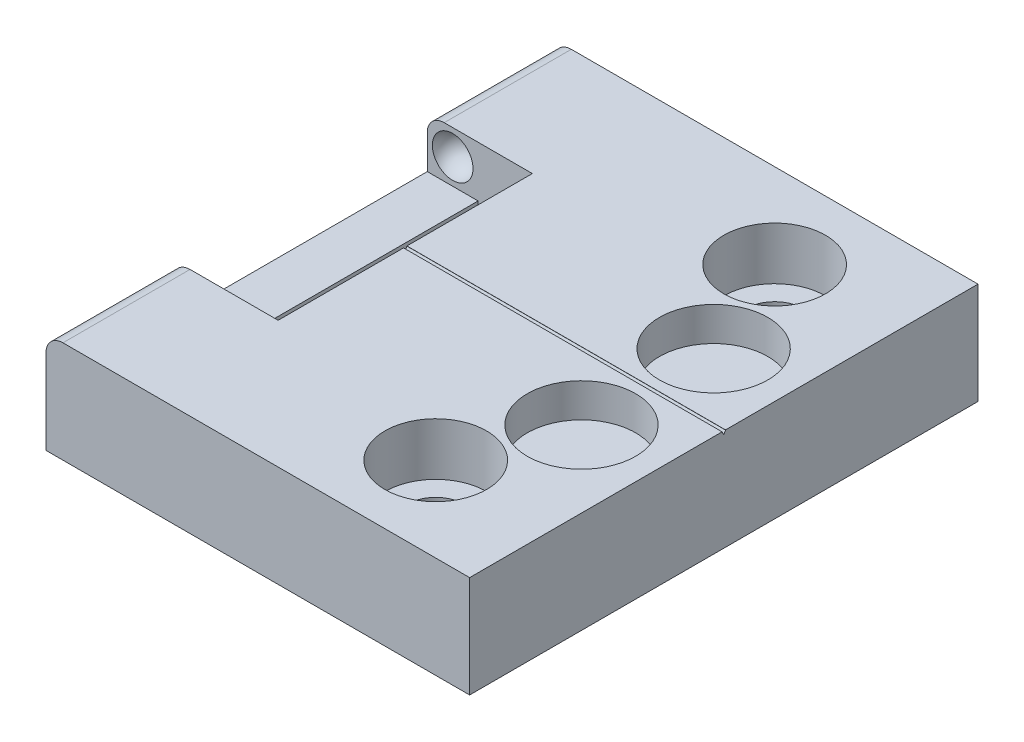
ISO-10303-21;
HEADER;
FILE_DESCRIPTION(('STEP AP214'),'2;1');
FILE_NAME('part.step','',(''),(''),'','','');
FILE_SCHEMA(('AUTOMOTIVE_DESIGN { 1 0 10303 214 1 1 1 1 }'));
ENDSEC;
DATA;
#1=APPLICATION_CONTEXT('core data for automotive mechanical design processes');
#2=APPLICATION_PROTOCOL_DEFINITION('international standard','automotive_design',2000,#1);
#3=PRODUCT_CONTEXT('',#1,'mechanical');
#4=PRODUCT('Part','Part','',(#3));
#5=PRODUCT_RELATED_PRODUCT_CATEGORY('part','',(#4));
#6=PRODUCT_DEFINITION_FORMATION('','',#4);
#7=PRODUCT_DEFINITION_CONTEXT('part definition',#1,'design');
#8=PRODUCT_DEFINITION('design','',#6,#7);
#9=PRODUCT_DEFINITION_SHAPE('','',#8);
#10=(LENGTH_UNIT() NAMED_UNIT(*) SI_UNIT(.MILLI.,.METRE.));
#11=(NAMED_UNIT(*) PLANE_ANGLE_UNIT() SI_UNIT($,.RADIAN.));
#12=(NAMED_UNIT(*) SI_UNIT($,.STERADIAN.) SOLID_ANGLE_UNIT());
#13=UNCERTAINTY_MEASURE_WITH_UNIT(LENGTH_MEASURE(1.E-05),#10,'distance_accuracy_value','');
#14=(GEOMETRIC_REPRESENTATION_CONTEXT(3) GLOBAL_UNCERTAINTY_ASSIGNED_CONTEXT((#13)) GLOBAL_UNIT_ASSIGNED_CONTEXT((#10,
#11,#12)) REPRESENTATION_CONTEXT('',''));
#15=CARTESIAN_POINT('',(0.,0.,0.));
#16=DIRECTION('',(0.,0.,1.));
#17=DIRECTION('',(1.,0.,0.));
#18=AXIS2_PLACEMENT_3D('',#15,#16,#17);
#19=CARTESIAN_POINT('',(0.,6.,0.));
#20=DIRECTION('',(0.,1.,0.));
#21=DIRECTION('',(0.,0.,1.));
#22=AXIS2_PLACEMENT_3D('',#19,#20,#21);
#23=PLANE('',#22);
#24=DIRECTION('',(-1.,0.,0.));
#25=VECTOR('',#24,1.);
#26=CARTESIAN_POINT('',(-12.5,6.,-7.5));
#27=LINE('',#26,#25);
#28=CARTESIAN_POINT('',(-6.29999999999999,6.,-7.5));
#29=VERTEX_POINT('',#28);
#30=CARTESIAN_POINT('',(-11.5,6.,-7.5));
#31=VERTEX_POINT('',#30);
#32=EDGE_CURVE('E224',#29,#31,#27,.T.);
#33=ORIENTED_EDGE('',*,*,#32,.F.);
#34=DIRECTION('',(0.,0.,-1.));
#35=VECTOR('',#34,1.);
#36=CARTESIAN_POINT('',(-6.29999999999999,6.,-7.5));
#37=LINE('',#36,#35);
#38=CARTESIAN_POINT('',(-6.29999999999999,6.,-0.1));
#39=VERTEX_POINT('',#38);
#40=EDGE_CURVE('E191',#39,#29,#37,.T.);
#41=ORIENTED_EDGE('',*,*,#40,.F.);
#42=DIRECTION('',(1.,0.,0.));
#43=VECTOR('',#42,1.);
#44=CARTESIAN_POINT('',(-7.5,6.,-0.1));
#45=LINE('',#44,#43);
#46=CARTESIAN_POINT('',(12.5,6.,-0.0999999999999994));
#47=VERTEX_POINT('',#46);
#48=EDGE_CURVE('E278',#39,#47,#45,.T.);
#49=ORIENTED_EDGE('',*,*,#48,.T.);
#50=DIRECTION('',(0.,0.,-1.));
#51=VECTOR('',#50,1.);
#52=CARTESIAN_POINT('',(12.5,6.,15.));
#53=LINE('',#52,#51);
#54=CARTESIAN_POINT('',(12.5,6.,-15.));
#55=VERTEX_POINT('',#54);
#56=EDGE_CURVE('E329',#47,#55,#53,.T.);
#57=ORIENTED_EDGE('',*,*,#56,.T.);
#58=DIRECTION('',(-1.,0.,0.));
#59=VECTOR('',#58,1.);
#60=CARTESIAN_POINT('',(12.5,6.,-15.));
#61=LINE('',#60,#59);
#62=CARTESIAN_POINT('',(-11.5,6.,-15.));
#63=VERTEX_POINT('',#62);
#64=EDGE_CURVE('E335',#55,#63,#61,.T.);
#65=ORIENTED_EDGE('',*,*,#64,.T.);
#66=DIRECTION('',(0.,0.,1.));
#67=VECTOR('',#66,1.);
#68=CARTESIAN_POINT('',(-11.5,6.,-7.5));
#69=LINE('',#68,#67);
#70=EDGE_CURVE('E365',#63,#31,#69,.T.);
#71=ORIENTED_EDGE('',*,*,#70,.T.);
#72=EDGE_LOOP('',(#33,#41,#49,#57,#65,#71));
#73=FACE_BOUND('',#72,.T.);
#74=CARTESIAN_POINT('',(5.5,6.,-9.99999999999999));
#75=DIRECTION('',(0.,1.,0.));
#76=DIRECTION('',(0.,0.,1.));
#77=AXIS2_PLACEMENT_3D('',#74,#75,#76);
#78=CIRCLE('',#77,3.);
#79=CARTESIAN_POINT('',(5.5,6.,-6.99999999999999));
#80=VERTEX_POINT('',#79);
#81=EDGE_CURVE('E290',#80,#80,#78,.T.);
#82=ORIENTED_EDGE('',*,*,#81,.F.);
#83=EDGE_LOOP('',(#82));
#84=FACE_BOUND('',#83,.T.);
#85=CARTESIAN_POINT('',(8.,6.,-3.9));
#86=DIRECTION('',(0.,1.,0.));
#87=DIRECTION('',(0.,0.,1.));
#88=AXIS2_PLACEMENT_3D('',#85,#86,#87);
#89=CIRCLE('',#88,3.2);
#90=CARTESIAN_POINT('',(8.,6.,-0.699999999999998));
#91=VERTEX_POINT('',#90);
#92=EDGE_CURVE('E267',#91,#91,#89,.T.);
#93=ORIENTED_EDGE('',*,*,#92,.F.);
#94=EDGE_LOOP('',(#93));
#95=FACE_BOUND('',#94,.T.);
#96=ADVANCED_FACE('F39',(#73,#84,#95),#23,.T.);
#97=CARTESIAN_POINT('',(-12.5,6.,15.));
#98=DIRECTION('',(1.,0.,0.));
#99=DIRECTION('',(0.,0.,-1.));
#100=AXIS2_PLACEMENT_3D('',#97,#98,#99);
#101=PLANE('',#100);
#102=DIRECTION('',(0.,-1.,0.));
#103=VECTOR('',#102,1.);
#104=CARTESIAN_POINT('',(-12.5,6.,15.));
#105=LINE('',#104,#103);
#106=CARTESIAN_POINT('',(-12.5,5.,15.));
#107=VERTEX_POINT('',#106);
#108=CARTESIAN_POINT('',(-12.5,0.,15.));
#109=VERTEX_POINT('',#108);
#110=EDGE_CURVE('E362',#107,#109,#105,.T.);
#111=ORIENTED_EDGE('',*,*,#110,.F.);
#112=DIRECTION('',(0.,0.,1.));
#113=VECTOR('',#112,1.);
#114=CARTESIAN_POINT('',(-12.5,5.,7.5));
#115=LINE('',#114,#113);
#116=CARTESIAN_POINT('',(-12.5,5.,7.5));
#117=VERTEX_POINT('',#116);
#118=EDGE_CURVE('E55',#107,#117,#115,.F.);
#119=ORIENTED_EDGE('',*,*,#118,.T.);
#120=DIRECTION('',(0.,1.,0.));
#121=VECTOR('',#120,1.);
#122=CARTESIAN_POINT('',(-12.5,3.,7.5));
#123=LINE('',#122,#121);
#124=CARTESIAN_POINT('',(-12.5,3.,7.5));
#125=VERTEX_POINT('',#124);
#126=EDGE_CURVE('E233',#125,#117,#123,.T.);
#127=ORIENTED_EDGE('',*,*,#126,.F.);
#128=DIRECTION('',(0.,0.,1.));
#129=VECTOR('',#128,1.);
#130=CARTESIAN_POINT('',(-12.5,3.,-7.5));
#131=LINE('',#130,#129);
#132=CARTESIAN_POINT('',(-12.5,3.,-7.5));
#133=VERTEX_POINT('',#132);
#134=EDGE_CURVE('E219',#133,#125,#131,.T.);
#135=ORIENTED_EDGE('',*,*,#134,.F.);
#136=DIRECTION('',(0.,1.,0.));
#137=VECTOR('',#136,1.);
#138=CARTESIAN_POINT('',(-12.5,3.,-7.5));
#139=LINE('',#138,#137);
#140=CARTESIAN_POINT('',(-12.5,5.,-7.5));
#141=VERTEX_POINT('',#140);
#142=EDGE_CURVE('E241',#133,#141,#139,.T.);
#143=ORIENTED_EDGE('',*,*,#142,.T.);
#144=DIRECTION('',(0.,0.,1.));
#145=VECTOR('',#144,1.);
#146=CARTESIAN_POINT('',(-12.5,5.,-15.));
#147=LINE('',#146,#145);
#148=CARTESIAN_POINT('',(-12.5,5.,-15.));
#149=VERTEX_POINT('',#148);
#150=EDGE_CURVE('E62',#141,#149,#147,.F.);
#151=ORIENTED_EDGE('',*,*,#150,.T.);
#152=DIRECTION('',(0.,-1.,0.));
#153=VECTOR('',#152,1.);
#154=CARTESIAN_POINT('',(-12.5,6.,-15.));
#155=LINE('',#154,#153);
#156=CARTESIAN_POINT('',(-12.5,0.,-15.));
#157=VERTEX_POINT('',#156);
#158=EDGE_CURVE('E339',#149,#157,#155,.T.);
#159=ORIENTED_EDGE('',*,*,#158,.T.);
#160=DIRECTION('',(0.,0.,1.));
#161=VECTOR('',#160,1.);
#162=CARTESIAN_POINT('',(-12.5,0.,15.));
#163=LINE('',#162,#161);
#164=EDGE_CURVE('E325',#157,#109,#163,.T.);
#165=ORIENTED_EDGE('',*,*,#164,.T.);
#166=EDGE_LOOP('',(#111,#119,#127,#135,#143,#151,#159,#165));
#167=FACE_BOUND('',#166,.T.);
#168=ADVANCED_FACE('F406',(#167),#101,.F.);
#169=CARTESIAN_POINT('',(12.5,6.,15.));
#170=DIRECTION('',(0.,0.,-1.));
#171=DIRECTION('',(-1.,0.,0.));
#172=AXIS2_PLACEMENT_3D('',#169,#170,#171);
#173=PLANE('',#172);
#174=DIRECTION('',(1.,0.,0.));
#175=VECTOR('',#174,1.);
#176=CARTESIAN_POINT('',(12.5,6.,15.));
#177=LINE('',#176,#175);
#178=CARTESIAN_POINT('',(-11.5,6.,15.));
#179=VERTEX_POINT('',#178);
#180=CARTESIAN_POINT('',(12.5,6.,15.));
#181=VERTEX_POINT('',#180);
#182=EDGE_CURVE('E326',#179,#181,#177,.T.);
#183=ORIENTED_EDGE('',*,*,#182,.F.);
#184=CARTESIAN_POINT('',(-11.5,5.,15.));
#185=DIRECTION('',(0.,0.,-1.));
#186=DIRECTION('',(-1.,0.,0.));
#187=AXIS2_PLACEMENT_3D('',#184,#185,#186);
#188=CIRCLE('',#187,1.);
#189=EDGE_CURVE('E379',#179,#107,#188,.F.);
#190=ORIENTED_EDGE('',*,*,#189,.T.);
#191=ORIENTED_EDGE('',*,*,#110,.T.);
#192=DIRECTION('',(1.,0.,0.));
#193=VECTOR('',#192,1.);
#194=CARTESIAN_POINT('',(12.5,0.,15.));
#195=LINE('',#194,#193);
#196=CARTESIAN_POINT('',(12.5,0.,15.));
#197=VERTEX_POINT('',#196);
#198=EDGE_CURVE('E343',#109,#197,#195,.T.);
#199=ORIENTED_EDGE('',*,*,#198,.T.);
#200=DIRECTION('',(0.,-1.,0.));
#201=VECTOR('',#200,1.);
#202=CARTESIAN_POINT('',(12.5,6.,15.));
#203=LINE('',#202,#201);
#204=EDGE_CURVE('E358',#181,#197,#203,.T.);
#205=ORIENTED_EDGE('',*,*,#204,.F.);
#206=EDGE_LOOP('',(#183,#190,#191,#199,#205));
#207=FACE_BOUND('',#206,.T.);
#208=ADVANCED_FACE('F470',(#207),#173,.F.);
#209=CARTESIAN_POINT('',(12.5,6.,15.));
#210=DIRECTION('',(-1.,0.,0.));
#211=DIRECTION('',(0.,0.,1.));
#212=AXIS2_PLACEMENT_3D('',#209,#210,#211);
#213=PLANE('',#212);
#214=DIRECTION('',(0.,1.,0.));
#215=VECTOR('',#214,1.);
#216=CARTESIAN_POINT('',(12.5,5.99,-0.1));
#217=LINE('',#216,#215);
#218=CARTESIAN_POINT('',(12.5,5.99,-0.1));
#219=VERTEX_POINT('',#218);
#220=EDGE_CURVE('E286',#219,#47,#217,.T.);
#221=ORIENTED_EDGE('',*,*,#220,.F.);
#222=DIRECTION('',(0.,0.884918222381981,-0.465746432832625));
#223=VECTOR('',#222,1.);
#224=CARTESIAN_POINT('',(12.5,5.8,0.));
#225=LINE('',#224,#223);
#226=CARTESIAN_POINT('',(12.5,5.8,0.));
#227=VERTEX_POINT('',#226);
#228=EDGE_CURVE('E250',#227,#219,#225,.T.);
#229=ORIENTED_EDGE('',*,*,#228,.F.);
#230=DIRECTION('',(0.,-0.884918222381981,-0.465746432832626));
#231=VECTOR('',#230,1.);
#232=CARTESIAN_POINT('',(12.5,5.99,0.1));
#233=LINE('',#232,#231);
#234=CARTESIAN_POINT('',(12.5,5.99,0.1));
#235=VERTEX_POINT('',#234);
#236=EDGE_CURVE('E244',#235,#227,#233,.T.);
#237=ORIENTED_EDGE('',*,*,#236,.F.);
#238=DIRECTION('',(0.,1.,0.));
#239=VECTOR('',#238,1.);
#240=CARTESIAN_POINT('',(12.5,5.99,0.1));
#241=LINE('',#240,#239);
#242=CARTESIAN_POINT('',(12.5,6.,0.1));
#243=VERTEX_POINT('',#242);
#244=EDGE_CURVE('E281',#235,#243,#241,.T.);
#245=ORIENTED_EDGE('',*,*,#244,.T.);
#246=EDGE_CURVE('E331',#181,#243,#53,.T.);
#247=ORIENTED_EDGE('',*,*,#246,.F.);
#248=ORIENTED_EDGE('',*,*,#204,.T.);
#249=DIRECTION('',(0.,0.,-1.));
#250=VECTOR('',#249,1.);
#251=CARTESIAN_POINT('',(12.5,0.,15.));
#252=LINE('',#251,#250);
#253=CARTESIAN_POINT('',(12.5,0.,-15.));
#254=VERTEX_POINT('',#253);
#255=EDGE_CURVE('E346',#197,#254,#252,.T.);
#256=ORIENTED_EDGE('',*,*,#255,.T.);
#257=DIRECTION('',(0.,-1.,0.));
#258=VECTOR('',#257,1.);
#259=CARTESIAN_POINT('',(12.5,6.,-15.));
#260=LINE('',#259,#258);
#261=EDGE_CURVE('E354',#55,#254,#260,.T.);
#262=ORIENTED_EDGE('',*,*,#261,.F.);
#263=ORIENTED_EDGE('',*,*,#56,.F.);
#264=EDGE_LOOP('',(#221,#229,#237,#245,#247,#248,#256,#262,#263));
#265=FACE_BOUND('',#264,.T.);
#266=ADVANCED_FACE('F422',(#265),#213,.F.);
#267=CARTESIAN_POINT('',(12.5,6.,-15.));
#268=DIRECTION('',(0.,0.,1.));
#269=DIRECTION('',(1.,0.,0.));
#270=AXIS2_PLACEMENT_3D('',#267,#268,#269);
#271=PLANE('',#270);
#272=ORIENTED_EDGE('',*,*,#158,.F.);
#273=CARTESIAN_POINT('',(-11.5,5.,-15.));
#274=DIRECTION('',(0.,0.,1.));
#275=DIRECTION('',(1.,0.,0.));
#276=AXIS2_PLACEMENT_3D('',#273,#274,#275);
#277=CIRCLE('',#276,1.);
#278=EDGE_CURVE('E48',#149,#63,#277,.F.);
#279=ORIENTED_EDGE('',*,*,#278,.T.);
#280=ORIENTED_EDGE('',*,*,#64,.F.);
#281=ORIENTED_EDGE('',*,*,#261,.T.);
#282=DIRECTION('',(-1.,0.,0.));
#283=VECTOR('',#282,1.);
#284=CARTESIAN_POINT('',(12.5,0.,-15.));
#285=LINE('',#284,#283);
#286=EDGE_CURVE('E330',#254,#157,#285,.T.);
#287=ORIENTED_EDGE('',*,*,#286,.T.);
#288=EDGE_LOOP('',(#272,#279,#280,#281,#287));
#289=FACE_BOUND('',#288,.T.);
#290=ADVANCED_FACE('F395',(#289),#271,.F.);
#291=CARTESIAN_POINT('',(-6.29999999999999,6.,7.5));
#292=VERTEX_POINT('',#291);
#293=CARTESIAN_POINT('',(-6.29999999999999,6.,0.1));
#294=VERTEX_POINT('',#293);
#295=EDGE_CURVE('E188',#292,#294,#37,.T.);
#296=ORIENTED_EDGE('',*,*,#295,.F.);
#297=DIRECTION('',(1.,0.,0.));
#298=VECTOR('',#297,1.);
#299=CARTESIAN_POINT('',(-12.5,6.,7.5));
#300=LINE('',#299,#298);
#301=CARTESIAN_POINT('',(-11.5,6.,7.5));
#302=VERTEX_POINT('',#301);
#303=EDGE_CURVE('E234',#302,#292,#300,.T.);
#304=ORIENTED_EDGE('',*,*,#303,.F.);
#305=DIRECTION('',(0.,0.,1.));
#306=VECTOR('',#305,1.);
#307=CARTESIAN_POINT('',(-11.5,6.,15.));
#308=LINE('',#307,#306);
#309=EDGE_CURVE('E375',#302,#179,#308,.T.);
#310=ORIENTED_EDGE('',*,*,#309,.T.);
#311=ORIENTED_EDGE('',*,*,#182,.T.);
#312=ORIENTED_EDGE('',*,*,#246,.T.);
#313=DIRECTION('',(1.,0.,0.));
#314=VECTOR('',#313,1.);
#315=CARTESIAN_POINT('',(-7.5,6.,0.1));
#316=LINE('',#315,#314);
#317=EDGE_CURVE('E262',#294,#243,#316,.T.);
#318=ORIENTED_EDGE('',*,*,#317,.F.);
#319=EDGE_LOOP('',(#296,#304,#310,#311,#312,#318));
#320=FACE_BOUND('',#319,.T.);
#321=CARTESIAN_POINT('',(8.,6.,3.9));
#322=DIRECTION('',(0.,1.,0.));
#323=DIRECTION('',(0.,0.,1.));
#324=AXIS2_PLACEMENT_3D('',#321,#322,#323);
#325=CIRCLE('',#324,3.2);
#326=CARTESIAN_POINT('',(8.,6.,7.1));
#327=VERTEX_POINT('',#326);
#328=EDGE_CURVE('E263',#327,#327,#325,.T.);
#329=ORIENTED_EDGE('',*,*,#328,.F.);
#330=EDGE_LOOP('',(#329));
#331=FACE_BOUND('',#330,.T.);
#332=CARTESIAN_POINT('',(5.50000000000001,6.,10.));
#333=DIRECTION('',(0.,1.,0.));
#334=DIRECTION('',(0.,0.,1.));
#335=AXIS2_PLACEMENT_3D('',#332,#333,#334);
#336=CIRCLE('',#335,3.);
#337=CARTESIAN_POINT('',(5.50000000000001,6.,13.));
#338=VERTEX_POINT('',#337);
#339=EDGE_CURVE('E309',#338,#338,#336,.T.);
#340=ORIENTED_EDGE('',*,*,#339,.F.);
#341=EDGE_LOOP('',(#340));
#342=FACE_BOUND('',#341,.T.);
#343=ADVANCED_FACE('F438',(#320,#331,#342),#23,.T.);
#344=CARTESIAN_POINT('',(0.,0.,0.));
#345=DIRECTION('',(0.,1.,0.));
#346=DIRECTION('',(0.,0.,1.));
#347=AXIS2_PLACEMENT_3D('',#344,#345,#346);
#348=PLANE('',#347);
#349=CARTESIAN_POINT('',(5.5,0.,-9.99999999999999));
#350=DIRECTION('',(0.,1.,0.));
#351=DIRECTION('',(0.,0.,1.));
#352=AXIS2_PLACEMENT_3D('',#349,#350,#351);
#353=CIRCLE('',#352,1.7);
#354=CARTESIAN_POINT('',(5.5,0.,-8.3));
#355=VERTEX_POINT('',#354);
#356=EDGE_CURVE('E305',#355,#355,#353,.T.);
#357=ORIENTED_EDGE('',*,*,#356,.T.);
#358=EDGE_LOOP('',(#357));
#359=FACE_BOUND('',#358,.T.);
#360=CARTESIAN_POINT('',(5.50000000000001,0.,10.));
#361=DIRECTION('',(0.,1.,0.));
#362=DIRECTION('',(0.,0.,1.));
#363=AXIS2_PLACEMENT_3D('',#360,#361,#362);
#364=CIRCLE('',#363,1.7);
#365=CARTESIAN_POINT('',(5.50000000000001,0.,11.7));
#366=VERTEX_POINT('',#365);
#367=EDGE_CURVE('E321',#366,#366,#364,.T.);
#368=ORIENTED_EDGE('',*,*,#367,.T.);
#369=EDGE_LOOP('',(#368));
#370=FACE_BOUND('',#369,.T.);
#371=ORIENTED_EDGE('',*,*,#164,.F.);
#372=ORIENTED_EDGE('',*,*,#286,.F.);
#373=ORIENTED_EDGE('',*,*,#255,.F.);
#374=ORIENTED_EDGE('',*,*,#198,.F.);
#375=EDGE_LOOP('',(#371,#372,#373,#374));
#376=FACE_BOUND('',#375,.T.);
#377=ADVANCED_FACE('F428',(#359,#370,#376),#348,.F.);
#378=CARTESIAN_POINT('',(5.50000000000001,6.,10.));
#379=DIRECTION('',(0.,1.,0.));
#380=DIRECTION('',(0.,0.,1.));
#381=AXIS2_PLACEMENT_3D('',#378,#379,#380);
#382=CYLINDRICAL_SURFACE('',#381,1.7);
#383=ORIENTED_EDGE('',*,*,#367,.F.);
#384=EDGE_LOOP('',(#383));
#385=FACE_BOUND('',#384,.T.);
#386=CARTESIAN_POINT('',(5.50000000000001,2.9,10.));
#387=DIRECTION('',(0.,1.,0.));
#388=DIRECTION('',(0.,0.,1.));
#389=AXIS2_PLACEMENT_3D('',#386,#387,#388);
#390=CIRCLE('',#389,1.7);
#391=CARTESIAN_POINT('',(5.50000000000001,2.9,11.7));
#392=VERTEX_POINT('',#391);
#393=EDGE_CURVE('E317',#392,#392,#390,.T.);
#394=ORIENTED_EDGE('',*,*,#393,.T.);
#395=EDGE_LOOP('',(#394));
#396=FACE_BOUND('',#395,.T.);
#397=ADVANCED_FACE('F479',(#385,#396),#382,.F.);
#398=CARTESIAN_POINT('',(7.2,2.9,10.));
#399=DIRECTION('',(0.,-1.,0.));
#400=DIRECTION('',(0.,0.,-1.));
#401=AXIS2_PLACEMENT_3D('',#398,#399,#400);
#402=PLANE('',#401);
#403=ORIENTED_EDGE('',*,*,#393,.F.);
#404=EDGE_LOOP('',(#403));
#405=FACE_BOUND('',#404,.T.);
#406=CARTESIAN_POINT('',(5.50000000000001,2.9,10.));
#407=DIRECTION('',(0.,1.,0.));
#408=DIRECTION('',(0.,0.,1.));
#409=AXIS2_PLACEMENT_3D('',#406,#407,#408);
#410=CIRCLE('',#409,3.);
#411=CARTESIAN_POINT('',(5.50000000000001,2.9,13.));
#412=VERTEX_POINT('',#411);
#413=EDGE_CURVE('E313',#412,#412,#410,.T.);
#414=ORIENTED_EDGE('',*,*,#413,.T.);
#415=EDGE_LOOP('',(#414));
#416=FACE_BOUND('',#415,.T.);
#417=ADVANCED_FACE('F572',(#405,#416),#402,.F.);
#418=CARTESIAN_POINT('',(5.50000000000001,6.,10.));
#419=DIRECTION('',(0.,1.,0.));
#420=DIRECTION('',(0.,0.,1.));
#421=AXIS2_PLACEMENT_3D('',#418,#419,#420);
#422=CYLINDRICAL_SURFACE('',#421,3.);
#423=ORIENTED_EDGE('',*,*,#413,.F.);
#424=EDGE_LOOP('',(#423));
#425=FACE_BOUND('',#424,.T.);
#426=ORIENTED_EDGE('',*,*,#339,.T.);
#427=EDGE_LOOP('',(#426));
#428=FACE_BOUND('',#427,.T.);
#429=ADVANCED_FACE('F581',(#425,#428),#422,.F.);
#430=CARTESIAN_POINT('',(5.5,6.,-9.99999999999999));
#431=DIRECTION('',(0.,1.,0.));
#432=DIRECTION('',(0.,0.,1.));
#433=AXIS2_PLACEMENT_3D('',#430,#431,#432);
#434=CYLINDRICAL_SURFACE('',#433,1.7);
#435=ORIENTED_EDGE('',*,*,#356,.F.);
#436=EDGE_LOOP('',(#435));
#437=FACE_BOUND('',#436,.T.);
#438=CARTESIAN_POINT('',(5.5,2.9,-9.99999999999999));
#439=DIRECTION('',(0.,1.,0.));
#440=DIRECTION('',(0.,0.,1.));
#441=AXIS2_PLACEMENT_3D('',#438,#439,#440);
#442=CIRCLE('',#441,1.7);
#443=CARTESIAN_POINT('',(5.5,2.9,-8.3));
#444=VERTEX_POINT('',#443);
#445=EDGE_CURVE('E301',#444,#444,#442,.T.);
#446=ORIENTED_EDGE('',*,*,#445,.T.);
#447=EDGE_LOOP('',(#446));
#448=FACE_BOUND('',#447,.T.);
#449=ADVANCED_FACE('F590',(#437,#448),#434,.F.);
#450=CARTESIAN_POINT('',(7.2,2.9,-9.99999999999999));
#451=DIRECTION('',(0.,-1.,0.));
#452=DIRECTION('',(0.,0.,-1.));
#453=AXIS2_PLACEMENT_3D('',#450,#451,#452);
#454=PLANE('',#453);
#455=ORIENTED_EDGE('',*,*,#445,.F.);
#456=EDGE_LOOP('',(#455));
#457=FACE_BOUND('',#456,.T.);
#458=CARTESIAN_POINT('',(5.5,2.9,-9.99999999999999));
#459=DIRECTION('',(0.,1.,0.));
#460=DIRECTION('',(0.,0.,1.));
#461=AXIS2_PLACEMENT_3D('',#458,#459,#460);
#462=CIRCLE('',#461,3.);
#463=CARTESIAN_POINT('',(5.5,2.9,-6.99999999999999));
#464=VERTEX_POINT('',#463);
#465=EDGE_CURVE('E297',#464,#464,#462,.T.);
#466=ORIENTED_EDGE('',*,*,#465,.T.);
#467=EDGE_LOOP('',(#466));
#468=FACE_BOUND('',#467,.T.);
#469=ADVANCED_FACE('F599',(#457,#468),#454,.F.);
#470=CARTESIAN_POINT('',(5.5,6.,-9.99999999999999));
#471=DIRECTION('',(0.,1.,0.));
#472=DIRECTION('',(0.,0.,1.));
#473=AXIS2_PLACEMENT_3D('',#470,#471,#472);
#474=CYLINDRICAL_SURFACE('',#473,3.);
#475=ORIENTED_EDGE('',*,*,#465,.F.);
#476=EDGE_LOOP('',(#475));
#477=FACE_BOUND('',#476,.T.);
#478=ORIENTED_EDGE('',*,*,#81,.T.);
#479=EDGE_LOOP('',(#478));
#480=FACE_BOUND('',#479,.T.);
#481=ADVANCED_FACE('F608',(#477,#480),#474,.F.);
#482=CARTESIAN_POINT('',(-7.5,5.99,0.1));
#483=DIRECTION('',(0.,0.,1.));
#484=DIRECTION('',(1.,0.,0.));
#485=AXIS2_PLACEMENT_3D('',#482,#483,#484);
#486=PLANE('',#485);
#487=DIRECTION('',(1.,0.,0.));
#488=VECTOR('',#487,1.);
#489=CARTESIAN_POINT('',(-7.5,5.99,0.1));
#490=LINE('',#489,#488);
#491=CARTESIAN_POINT('',(-6.29999999999999,5.99,0.0999999999999998));
#492=VERTEX_POINT('',#491);
#493=EDGE_CURVE('E274',#492,#235,#490,.T.);
#494=ORIENTED_EDGE('',*,*,#493,.F.);
#495=DIRECTION('',(0.,1.,0.));
#496=VECTOR('',#495,1.);
#497=CARTESIAN_POINT('',(-6.29999999999999,5.99,0.1));
#498=LINE('',#497,#496);
#499=EDGE_CURVE('E214',#492,#294,#498,.T.);
#500=ORIENTED_EDGE('',*,*,#499,.T.);
#501=ORIENTED_EDGE('',*,*,#317,.T.);
#502=ORIENTED_EDGE('',*,*,#244,.F.);
#503=EDGE_LOOP('',(#494,#500,#501,#502));
#504=FACE_BOUND('',#503,.T.);
#505=ADVANCED_FACE('F444',(#504),#486,.F.);
#506=CARTESIAN_POINT('',(-7.5,5.99,-0.1));
#507=DIRECTION('',(0.,0.,1.));
#508=DIRECTION('',(1.,0.,0.));
#509=AXIS2_PLACEMENT_3D('',#506,#507,#508);
#510=PLANE('',#509);
#511=DIRECTION('',(0.,1.,0.));
#512=VECTOR('',#511,1.);
#513=CARTESIAN_POINT('',(-6.29999999999999,5.99,-0.1));
#514=LINE('',#513,#512);
#515=CARTESIAN_POINT('',(-6.29999999999999,5.99,-0.0999999999999998));
#516=VERTEX_POINT('',#515);
#517=EDGE_CURVE('E211',#516,#39,#514,.T.);
#518=ORIENTED_EDGE('',*,*,#517,.F.);
#519=DIRECTION('',(1.,0.,0.));
#520=VECTOR('',#519,1.);
#521=CARTESIAN_POINT('',(-7.5,5.99,-0.1));
#522=LINE('',#521,#520);
#523=EDGE_CURVE('E277',#516,#219,#522,.T.);
#524=ORIENTED_EDGE('',*,*,#523,.T.);
#525=ORIENTED_EDGE('',*,*,#220,.T.);
#526=ORIENTED_EDGE('',*,*,#48,.F.);
#527=EDGE_LOOP('',(#518,#524,#525,#526));
#528=FACE_BOUND('',#527,.T.);
#529=ADVANCED_FACE('F417',(#528),#510,.T.);
#530=CARTESIAN_POINT('',(8.,4.,-3.9));
#531=DIRECTION('',(0.,1.,0.));
#532=DIRECTION('',(0.,0.,1.));
#533=AXIS2_PLACEMENT_3D('',#530,#531,#532);
#534=CYLINDRICAL_SURFACE('',#533,3.2);
#535=CARTESIAN_POINT('',(8.,4.,-3.9));
#536=DIRECTION('',(0.,1.,0.));
#537=DIRECTION('',(0.,0.,1.));
#538=AXIS2_PLACEMENT_3D('',#535,#536,#537);
#539=CIRCLE('',#538,3.2);
#540=CARTESIAN_POINT('',(8.,4.,-0.699999999999998));
#541=VERTEX_POINT('',#540);
#542=EDGE_CURVE('E257',#541,#541,#539,.T.);
#543=ORIENTED_EDGE('',*,*,#542,.F.);
#544=EDGE_LOOP('',(#543));
#545=FACE_BOUND('',#544,.T.);
#546=ORIENTED_EDGE('',*,*,#92,.T.);
#547=EDGE_LOOP('',(#546));
#548=FACE_BOUND('',#547,.T.);
#549=ADVANCED_FACE('F632',(#545,#548),#534,.F.);
#550=CARTESIAN_POINT('',(8.,4.,-3.9));
#551=DIRECTION('',(0.,1.,0.));
#552=DIRECTION('',(0.,0.,1.));
#553=AXIS2_PLACEMENT_3D('',#550,#551,#552);
#554=PLANE('',#553);
#555=ORIENTED_EDGE('',*,*,#542,.T.);
#556=EDGE_LOOP('',(#555));
#557=FACE_BOUND('',#556,.T.);
#558=ADVANCED_FACE('F640',(#557),#554,.T.);
#559=CARTESIAN_POINT('',(8.,4.,3.9));
#560=DIRECTION('',(0.,1.,0.));
#561=DIRECTION('',(0.,0.,1.));
#562=AXIS2_PLACEMENT_3D('',#559,#560,#561);
#563=CYLINDRICAL_SURFACE('',#562,3.2);
#564=CARTESIAN_POINT('',(8.,4.,3.9));
#565=DIRECTION('',(0.,1.,0.));
#566=DIRECTION('',(0.,0.,1.));
#567=AXIS2_PLACEMENT_3D('',#564,#565,#566);
#568=CIRCLE('',#567,3.2);
#569=CARTESIAN_POINT('',(8.,4.,7.1));
#570=VERTEX_POINT('',#569);
#571=EDGE_CURVE('E258',#570,#570,#568,.T.);
#572=ORIENTED_EDGE('',*,*,#571,.F.);
#573=EDGE_LOOP('',(#572));
#574=FACE_BOUND('',#573,.T.);
#575=ORIENTED_EDGE('',*,*,#328,.T.);
#576=EDGE_LOOP('',(#575));
#577=FACE_BOUND('',#576,.T.);
#578=ADVANCED_FACE('F461',(#574,#577),#563,.F.);
#579=CARTESIAN_POINT('',(8.,4.,3.9));
#580=DIRECTION('',(0.,1.,0.));
#581=DIRECTION('',(0.,0.,1.));
#582=AXIS2_PLACEMENT_3D('',#579,#580,#581);
#583=PLANE('',#582);
#584=ORIENTED_EDGE('',*,*,#571,.T.);
#585=EDGE_LOOP('',(#584));
#586=FACE_BOUND('',#585,.T.);
#587=ADVANCED_FACE('F454',(#586),#583,.T.);
#588=CARTESIAN_POINT('',(-7.5,5.8,0.));
#589=DIRECTION('',(0.,-0.465746432832625,-0.884918222381981));
#590=DIRECTION('',(0.,0.884918222381981,-0.465746432832625));
#591=AXIS2_PLACEMENT_3D('',#588,#589,#590);
#592=PLANE('',#591);
#593=ORIENTED_EDGE('',*,*,#523,.F.);
#594=DIRECTION('',(0.,-0.884918222381981,0.465746432832625));
#595=VECTOR('',#594,1.);
#596=CARTESIAN_POINT('',(-6.29999999999999,5.8,0.));
#597=LINE('',#596,#595);
#598=CARTESIAN_POINT('',(-6.29999999999999,5.8,0.));
#599=VERTEX_POINT('',#598);
#600=EDGE_CURVE('E201',#516,#599,#597,.T.);
#601=ORIENTED_EDGE('',*,*,#600,.T.);
#602=DIRECTION('',(1.,0.,0.));
#603=VECTOR('',#602,1.);
#604=CARTESIAN_POINT('',(-7.5,5.8,0.));
#605=LINE('',#604,#603);
#606=EDGE_CURVE('E254',#599,#227,#605,.T.);
#607=ORIENTED_EDGE('',*,*,#606,.T.);
#608=ORIENTED_EDGE('',*,*,#228,.T.);
#609=EDGE_LOOP('',(#593,#601,#607,#608));
#610=FACE_BOUND('',#609,.T.);
#611=ADVANCED_FACE('F452',(#610),#592,.F.);
#612=CARTESIAN_POINT('',(-7.5,5.99,0.1));
#613=DIRECTION('',(0.,-0.465746432832626,0.884918222381981));
#614=DIRECTION('',(0.,-0.884918222381981,-0.465746432832626));
#615=AXIS2_PLACEMENT_3D('',#612,#613,#614);
#616=PLANE('',#615);
#617=ORIENTED_EDGE('',*,*,#606,.F.);
#618=DIRECTION('',(0.,0.884918222381981,0.465746432832626));
#619=VECTOR('',#618,1.);
#620=CARTESIAN_POINT('',(-6.29999999999999,5.99,0.1));
#621=LINE('',#620,#619);
#622=EDGE_CURVE('E11',#599,#492,#621,.T.);
#623=ORIENTED_EDGE('',*,*,#622,.T.);
#624=ORIENTED_EDGE('',*,*,#493,.T.);
#625=ORIENTED_EDGE('',*,*,#236,.T.);
#626=EDGE_LOOP('',(#617,#623,#624,#625));
#627=FACE_BOUND('',#626,.T.);
#628=ADVANCED_FACE('F449',(#627),#616,.F.);
#629=CARTESIAN_POINT('',(-12.5,3.,-7.5));
#630=DIRECTION('',(0.,0.,-1.));
#631=DIRECTION('',(-1.,0.,0.));
#632=AXIS2_PLACEMENT_3D('',#629,#630,#631);
#633=PLANE('',#632);
#634=CARTESIAN_POINT('',(-11.,4.5,-7.5));
#635=DIRECTION('',(0.,0.,-1.));
#636=DIRECTION('',(-1.,0.,0.));
#637=AXIS2_PLACEMENT_3D('',#634,#635,#636);
#638=CIRCLE('',#637,1.2);
#639=CARTESIAN_POINT('',(-12.2,4.5,-7.5));
#640=VERTEX_POINT('',#639);
#641=EDGE_CURVE('E237',#640,#640,#638,.F.);
#642=ORIENTED_EDGE('',*,*,#641,.F.);
#643=EDGE_LOOP('',(#642));
#644=FACE_BOUND('',#643,.T.);
#645=ORIENTED_EDGE('',*,*,#32,.T.);
#646=CARTESIAN_POINT('',(-11.5,5.,-7.5));
#647=DIRECTION('',(0.,0.,-1.));
#648=DIRECTION('',(-1.,0.,0.));
#649=AXIS2_PLACEMENT_3D('',#646,#647,#648);
#650=CIRCLE('',#649,1.);
#651=EDGE_CURVE('E389',#31,#141,#650,.F.);
#652=ORIENTED_EDGE('',*,*,#651,.T.);
#653=ORIENTED_EDGE('',*,*,#142,.F.);
#654=DIRECTION('',(-1.,0.,0.));
#655=VECTOR('',#654,1.);
#656=CARTESIAN_POINT('',(-12.5,3.,-7.5));
#657=LINE('',#656,#655);
#658=CARTESIAN_POINT('',(-9.49999999999999,3.,-7.5));
#659=VERTEX_POINT('',#658);
#660=EDGE_CURVE('E229',#659,#133,#657,.T.);
#661=ORIENTED_EDGE('',*,*,#660,.F.);
#662=DIRECTION('',(0.,1.,0.));
#663=VECTOR('',#662,1.);
#664=CARTESIAN_POINT('',(-9.49999999999999,2.,-7.5));
#665=LINE('',#664,#663);
#666=CARTESIAN_POINT('',(-9.49999999999999,2.,-7.5));
#667=VERTEX_POINT('',#666);
#668=EDGE_CURVE('E198',#667,#659,#665,.T.);
#669=ORIENTED_EDGE('',*,*,#668,.F.);
#670=DIRECTION('',(-1.,0.,0.));
#671=VECTOR('',#670,1.);
#672=CARTESIAN_POINT('',(-9.49999999999999,2.,-7.5));
#673=LINE('',#672,#671);
#674=CARTESIAN_POINT('',(-6.29999999999999,2.,-7.5));
#675=VERTEX_POINT('',#674);
#676=EDGE_CURVE('E173',#675,#667,#673,.T.);
#677=ORIENTED_EDGE('',*,*,#676,.F.);
#678=DIRECTION('',(0.,1.,0.));
#679=VECTOR('',#678,1.);
#680=CARTESIAN_POINT('',(-6.29999999999999,2.,-7.5));
#681=LINE('',#680,#679);
#682=EDGE_CURVE('E202',#675,#29,#681,.T.);
#683=ORIENTED_EDGE('',*,*,#682,.T.);
#684=EDGE_LOOP('',(#645,#652,#653,#661,#669,#677,#683));
#685=FACE_BOUND('',#684,.T.);
#686=ADVANCED_FACE('F403',(#644,#685),#633,.F.);
#687=CARTESIAN_POINT('',(-12.5,3.,7.5));
#688=DIRECTION('',(0.,0.,1.));
#689=DIRECTION('',(1.,0.,0.));
#690=AXIS2_PLACEMENT_3D('',#687,#688,#689);
#691=PLANE('',#690);
#692=CARTESIAN_POINT('',(-11.,4.5,7.5));
#693=DIRECTION('',(0.,0.,1.));
#694=DIRECTION('',(1.,0.,0.));
#695=AXIS2_PLACEMENT_3D('',#692,#693,#694);
#696=CIRCLE('',#695,1.2);
#697=CARTESIAN_POINT('',(-9.8,4.5,7.5));
#698=VERTEX_POINT('',#697);
#699=EDGE_CURVE('E218',#698,#698,#696,.F.);
#700=ORIENTED_EDGE('',*,*,#699,.F.);
#701=EDGE_LOOP('',(#700));
#702=FACE_BOUND('',#701,.T.);
#703=ORIENTED_EDGE('',*,*,#126,.T.);
#704=CARTESIAN_POINT('',(-11.5,5.,7.5));
#705=DIRECTION('',(0.,0.,1.));
#706=DIRECTION('',(1.,0.,0.));
#707=AXIS2_PLACEMENT_3D('',#704,#705,#706);
#708=CIRCLE('',#707,1.);
#709=EDGE_CURVE('E386',#117,#302,#708,.F.);
#710=ORIENTED_EDGE('',*,*,#709,.T.);
#711=ORIENTED_EDGE('',*,*,#303,.T.);
#712=DIRECTION('',(0.,1.,0.));
#713=VECTOR('',#712,1.);
#714=CARTESIAN_POINT('',(-6.29999999999999,2.,7.5));
#715=LINE('',#714,#713);
#716=CARTESIAN_POINT('',(-6.29999999999999,2.,7.5));
#717=VERTEX_POINT('',#716);
#718=EDGE_CURVE('E172',#717,#292,#715,.T.);
#719=ORIENTED_EDGE('',*,*,#718,.F.);
#720=DIRECTION('',(1.,0.,0.));
#721=VECTOR('',#720,1.);
#722=CARTESIAN_POINT('',(-9.49999999999999,2.,7.5));
#723=LINE('',#722,#721);
#724=CARTESIAN_POINT('',(-9.49999999999999,2.,7.5));
#725=VERTEX_POINT('',#724);
#726=EDGE_CURVE('E176',#725,#717,#723,.T.);
#727=ORIENTED_EDGE('',*,*,#726,.F.);
#728=DIRECTION('',(0.,1.,0.));
#729=VECTOR('',#728,1.);
#730=CARTESIAN_POINT('',(-9.49999999999999,2.,7.5));
#731=LINE('',#730,#729);
#732=CARTESIAN_POINT('',(-9.49999999999999,3.,7.5));
#733=VERTEX_POINT('',#732);
#734=EDGE_CURVE('E161',#725,#733,#731,.T.);
#735=ORIENTED_EDGE('',*,*,#734,.T.);
#736=DIRECTION('',(1.,0.,0.));
#737=VECTOR('',#736,1.);
#738=CARTESIAN_POINT('',(-12.5,3.,7.5));
#739=LINE('',#738,#737);
#740=EDGE_CURVE('E223',#125,#733,#739,.T.);
#741=ORIENTED_EDGE('',*,*,#740,.F.);
#742=EDGE_LOOP('',(#703,#710,#711,#719,#727,#735,#741));
#743=FACE_BOUND('',#742,.T.);
#744=ADVANCED_FACE('F177',(#702,#743),#691,.F.);
#745=CARTESIAN_POINT('',(0.,3.,0.));
#746=DIRECTION('',(0.,1.,0.));
#747=DIRECTION('',(0.,0.,1.));
#748=AXIS2_PLACEMENT_3D('',#745,#746,#747);
#749=PLANE('',#748);
#750=ORIENTED_EDGE('',*,*,#134,.T.);
#751=ORIENTED_EDGE('',*,*,#740,.T.);
#752=DIRECTION('',(0.,0.,-1.));
#753=VECTOR('',#752,1.);
#754=CARTESIAN_POINT('',(-9.49999999999999,3.,-7.5));
#755=LINE('',#754,#753);
#756=EDGE_CURVE('E168',#733,#659,#755,.T.);
#757=ORIENTED_EDGE('',*,*,#756,.T.);
#758=ORIENTED_EDGE('',*,*,#660,.T.);
#759=EDGE_LOOP('',(#750,#751,#757,#758));
#760=FACE_BOUND('',#759,.T.);
#761=ADVANCED_FACE('F408',(#760),#749,.T.);
#762=CARTESIAN_POINT('',(-11.,4.5,-7.5));
#763=DIRECTION('',(0.,1.,0.));
#764=DIRECTION('',(1.,0.,0.));
#765=AXIS2_PLACEMENT_3D('',#762,#763,#764);
#766=SPHERICAL_SURFACE('',#765,1.2);
#767=CARTESIAN_POINT('',(-11.,4.5,-7.5));
#768=DIRECTION('',(0.,0.,-1.));
#769=DIRECTION('',(-1.,0.,0.));
#770=AXIS2_PLACEMENT_3D('',#767,#768,#769);
#771=SPHERICAL_SURFACE('',#770,1.2);
#772=ORIENTED_EDGE('',*,*,#641,.T.);
#773=EDGE_LOOP('',(#772));
#774=FACE_BOUND('',#773,.T.);
#775=ADVANCED_FACE('F494',(#774),#771,.F.);
#776=CARTESIAN_POINT('',(-11.,4.5,7.5));
#777=DIRECTION('',(0.,1.,0.));
#778=DIRECTION('',(1.,0.,0.));
#779=AXIS2_PLACEMENT_3D('',#776,#777,#778);
#780=SPHERICAL_SURFACE('',#779,1.2);
#781=CARTESIAN_POINT('',(-11.,4.5,7.5));
#782=DIRECTION('',(0.,0.,1.));
#783=DIRECTION('',(1.,0.,0.));
#784=AXIS2_PLACEMENT_3D('',#781,#782,#783);
#785=SPHERICAL_SURFACE('',#784,1.2);
#786=ORIENTED_EDGE('',*,*,#699,.T.);
#787=EDGE_LOOP('',(#786));
#788=FACE_BOUND('',#787,.T.);
#789=ADVANCED_FACE('F489',(#788),#785,.F.);
#790=CARTESIAN_POINT('',(-11.5,5.,0.));
#791=DIRECTION('',(0.,0.,-1.));
#792=DIRECTION('',(-1.,0.,0.));
#793=AXIS2_PLACEMENT_3D('',#790,#791,#792);
#794=CYLINDRICAL_SURFACE('',#793,1.);
#795=ORIENTED_EDGE('',*,*,#709,.F.);
#796=ORIENTED_EDGE('',*,*,#118,.F.);
#797=ORIENTED_EDGE('',*,*,#189,.F.);
#798=ORIENTED_EDGE('',*,*,#309,.F.);
#799=EDGE_LOOP('',(#795,#796,#797,#798));
#800=FACE_BOUND('',#799,.T.);
#801=ADVANCED_FACE('F433',(#800),#794,.T.);
#802=CARTESIAN_POINT('',(-11.5,5.,0.));
#803=DIRECTION('',(0.,0.,-1.));
#804=DIRECTION('',(-1.,0.,0.));
#805=AXIS2_PLACEMENT_3D('',#802,#803,#804);
#806=CYLINDRICAL_SURFACE('',#805,1.);
#807=ORIENTED_EDGE('',*,*,#278,.F.);
#808=ORIENTED_EDGE('',*,*,#150,.F.);
#809=ORIENTED_EDGE('',*,*,#651,.F.);
#810=ORIENTED_EDGE('',*,*,#70,.F.);
#811=EDGE_LOOP('',(#807,#808,#809,#810));
#812=FACE_BOUND('',#811,.T.);
#813=ADVANCED_FACE('F41',(#812),#806,.T.);
#814=CARTESIAN_POINT('',(-6.29999999999999,2.,-7.5));
#815=DIRECTION('',(1.,0.,0.));
#816=DIRECTION('',(0.,0.,-1.));
#817=AXIS2_PLACEMENT_3D('',#814,#815,#816);
#818=PLANE('',#817);
#819=ORIENTED_EDGE('',*,*,#622,.F.);
#820=ORIENTED_EDGE('',*,*,#600,.F.);
#821=ORIENTED_EDGE('',*,*,#517,.T.);
#822=ORIENTED_EDGE('',*,*,#40,.T.);
#823=ORIENTED_EDGE('',*,*,#682,.F.);
#824=DIRECTION('',(0.,0.,-1.));
#825=VECTOR('',#824,1.);
#826=CARTESIAN_POINT('',(-6.29999999999999,2.,-7.5));
#827=LINE('',#826,#825);
#828=EDGE_CURVE('E183',#717,#675,#827,.T.);
#829=ORIENTED_EDGE('',*,*,#828,.F.);
#830=ORIENTED_EDGE('',*,*,#718,.T.);
#831=ORIENTED_EDGE('',*,*,#295,.T.);
#832=ORIENTED_EDGE('',*,*,#499,.F.);
#833=EDGE_LOOP('',(#819,#820,#821,#822,#823,#829,#830,#831,#832));
#834=FACE_BOUND('',#833,.T.);
#835=ADVANCED_FACE('F411',(#834),#818,.F.);
#836=CARTESIAN_POINT('',(-9.49999999999999,2.,-7.5));
#837=DIRECTION('',(-1.,0.,0.));
#838=DIRECTION('',(0.,0.,1.));
#839=AXIS2_PLACEMENT_3D('',#836,#837,#838);
#840=PLANE('',#839);
#841=ORIENTED_EDGE('',*,*,#756,.F.);
#842=ORIENTED_EDGE('',*,*,#734,.F.);
#843=DIRECTION('',(0.,0.,1.));
#844=VECTOR('',#843,1.);
#845=CARTESIAN_POINT('',(-9.49999999999999,2.,-7.5));
#846=LINE('',#845,#844);
#847=EDGE_CURVE('E165',#667,#725,#846,.T.);
#848=ORIENTED_EDGE('',*,*,#847,.F.);
#849=ORIENTED_EDGE('',*,*,#668,.T.);
#850=EDGE_LOOP('',(#841,#842,#848,#849));
#851=FACE_BOUND('',#850,.T.);
#852=ADVANCED_FACE('F163',(#851),#840,.F.);
#853=CARTESIAN_POINT('',(0.,2.,0.));
#854=DIRECTION('',(0.,1.,0.));
#855=DIRECTION('',(0.,0.,1.));
#856=AXIS2_PLACEMENT_3D('',#853,#854,#855);
#857=PLANE('',#856);
#858=ORIENTED_EDGE('',*,*,#847,.T.);
#859=ORIENTED_EDGE('',*,*,#726,.T.);
#860=ORIENTED_EDGE('',*,*,#828,.T.);
#861=ORIENTED_EDGE('',*,*,#676,.T.);
#862=EDGE_LOOP('',(#858,#859,#860,#861));
#863=FACE_BOUND('',#862,.T.);
#864=ADVANCED_FACE('F185',(#863),#857,.T.);
#865=CLOSED_SHELL('',(#96,#168,#208,#266,#290,#343,#377,#397,#417,#429,#449,#469,#481,#505,#529,
#549,#558,#578,#587,#611,#628,#686,#744,#761,#775,#789,#801,#813,#835,#852,#864));
#866=MANIFOLD_SOLID_BREP('B2',#865);
#867=ADVANCED_BREP_SHAPE_REPRESENTATION('',(#18,#866),#14);
#868=SHAPE_DEFINITION_REPRESENTATION(#9,#867);
ENDSEC;
END-ISO-10303-21;
